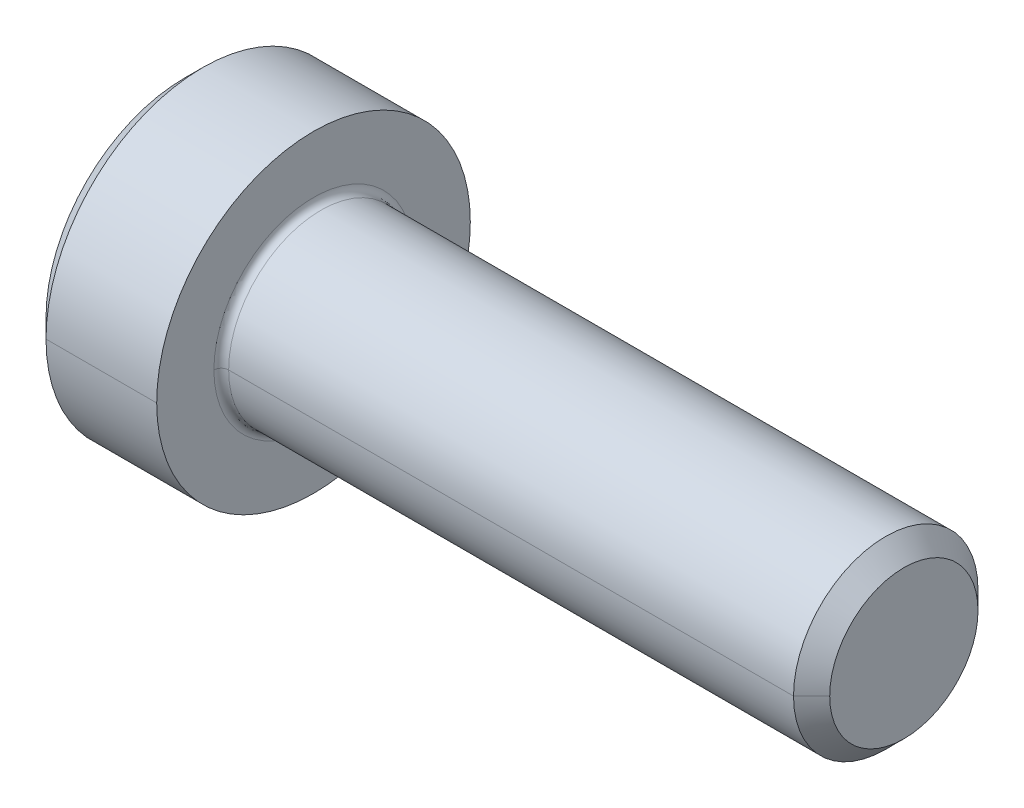
ISO-10303-21;
HEADER;
FILE_DESCRIPTION(('STEP AP214'),'2;1');
FILE_NAME('part.step','',(''),(''),'','','');
FILE_SCHEMA(('AUTOMOTIVE_DESIGN { 1 0 10303 214 1 1 1 1 }'));
ENDSEC;
DATA;
#1=APPLICATION_CONTEXT('core data for automotive mechanical design processes');
#2=APPLICATION_PROTOCOL_DEFINITION('international standard','automotive_design',2000,#1);
#3=PRODUCT_CONTEXT('',#1,'mechanical');
#4=PRODUCT('Part','Part','',(#3));
#5=PRODUCT_RELATED_PRODUCT_CATEGORY('part','',(#4));
#6=PRODUCT_DEFINITION_FORMATION('','',#4);
#7=PRODUCT_DEFINITION_CONTEXT('part definition',#1,'design');
#8=PRODUCT_DEFINITION('design','',#6,#7);
#9=PRODUCT_DEFINITION_SHAPE('','',#8);
#10=(LENGTH_UNIT() NAMED_UNIT(*) SI_UNIT(.MILLI.,.METRE.));
#11=(NAMED_UNIT(*) PLANE_ANGLE_UNIT() SI_UNIT($,.RADIAN.));
#12=(NAMED_UNIT(*) SI_UNIT($,.STERADIAN.) SOLID_ANGLE_UNIT());
#13=UNCERTAINTY_MEASURE_WITH_UNIT(LENGTH_MEASURE(1.E-05),#10,'distance_accuracy_value','');
#14=(GEOMETRIC_REPRESENTATION_CONTEXT(3) GLOBAL_UNCERTAINTY_ASSIGNED_CONTEXT((#13)) GLOBAL_UNIT_ASSIGNED_CONTEXT((#10,
#11,#12)) REPRESENTATION_CONTEXT('',''));
#15=CARTESIAN_POINT('',(0.,0.,0.));
#16=DIRECTION('',(0.,0.,1.));
#17=DIRECTION('',(1.,0.,0.));
#18=AXIS2_PLACEMENT_3D('',#15,#16,#17);
#19=CARTESIAN_POINT('',(-1.,0.,0.));
#20=DIRECTION('',(-1.,0.,0.));
#21=DIRECTION('',(0.,1.,0.));
#22=AXIS2_PLACEMENT_3D('',#19,#20,#21);
#23=CONICAL_SURFACE('',#22,2.,1.0471975512);
#24=DIRECTION('',(-0.499999999997054,0.,-0.86602540378614));
#25=VECTOR('',#24,1.);
#26=CARTESIAN_POINT('',(0.154700538370179,0.,0.));
#27=LINE('',#26,#25);
#28=CARTESIAN_POINT('',(0.15470053837925,0.,0.));
#29=VERTEX_POINT('',#28);
#30=CARTESIAN_POINT('',(-1.,0.,-2.));
#31=VERTEX_POINT('',#30);
#32=EDGE_CURVE('E11',#29,#31,#27,.T.);
#33=ORIENTED_EDGE('',*,*,#32,.T.);
#34=CARTESIAN_POINT('',(-1.,0.,0.));
#35=DIRECTION('',(1.,0.,0.));
#36=DIRECTION('',(0.,0.,-1.));
#37=AXIS2_PLACEMENT_3D('',#34,#35,#36);
#38=CIRCLE('',#37,2.);
#39=CARTESIAN_POINT('',(-1.,-1.7320508075689,-0.999999999999966));
#40=VERTEX_POINT('',#39);
#41=EDGE_CURVE('E24',#40,#31,#38,.T.);
#42=ORIENTED_EDGE('',*,*,#41,.F.);
#43=CARTESIAN_POINT('',(-1.,0.,0.));
#44=DIRECTION('',(1.,0.,0.));
#45=DIRECTION('',(0.,0.,-1.));
#46=AXIS2_PLACEMENT_3D('',#43,#44,#45);
#47=CIRCLE('',#46,2.);
#48=CARTESIAN_POINT('',(-1.,-1.7320508075689,0.999999999999966));
#49=VERTEX_POINT('',#48);
#50=EDGE_CURVE('E432',#49,#40,#47,.T.);
#51=ORIENTED_EDGE('',*,*,#50,.F.);
#52=CARTESIAN_POINT('',(-1.,0.,0.));
#53=DIRECTION('',(1.,0.,0.));
#54=DIRECTION('',(0.,0.,-1.));
#55=AXIS2_PLACEMENT_3D('',#52,#53,#54);
#56=CIRCLE('',#55,2.);
#57=CARTESIAN_POINT('',(-1.,0.,2.));
#58=VERTEX_POINT('',#57);
#59=EDGE_CURVE('E427',#58,#49,#56,.T.);
#60=ORIENTED_EDGE('',*,*,#59,.F.);
#61=DIRECTION('',(-0.499999999997054,0.,0.86602540378614));
#62=VECTOR('',#61,1.);
#63=CARTESIAN_POINT('',(0.154700538370179,0.,0.));
#64=LINE('',#63,#62);
#65=EDGE_CURVE('E422',#29,#58,#64,.T.);
#66=ORIENTED_EDGE('',*,*,#65,.F.);
#67=EDGE_LOOP('',(#33,#42,#51,#60,#66));
#68=FACE_BOUND('',#67,.T.);
#69=ADVANCED_FACE('F16',(#68),#23,.F.);
#70=CARTESIAN_POINT('',(-1.,0.,0.));
#71=DIRECTION('',(-1.,0.,0.));
#72=DIRECTION('',(0.,-1.,0.));
#73=AXIS2_PLACEMENT_3D('',#70,#71,#72);
#74=CONICAL_SURFACE('',#73,2.,1.0471975512);
#75=ORIENTED_EDGE('',*,*,#65,.T.);
#76=CARTESIAN_POINT('',(-1.,0.,0.));
#77=DIRECTION('',(1.,0.,0.));
#78=DIRECTION('',(0.,0.,-1.));
#79=AXIS2_PLACEMENT_3D('',#76,#77,#78);
#80=CIRCLE('',#79,2.);
#81=CARTESIAN_POINT('',(-1.,1.7320508075689,0.999999999999966));
#82=VERTEX_POINT('',#81);
#83=EDGE_CURVE('E417',#82,#58,#80,.T.);
#84=ORIENTED_EDGE('',*,*,#83,.F.);
#85=CARTESIAN_POINT('',(-1.,0.,0.));
#86=DIRECTION('',(1.,0.,0.));
#87=DIRECTION('',(0.,0.,-1.));
#88=AXIS2_PLACEMENT_3D('',#85,#86,#87);
#89=CIRCLE('',#88,2.);
#90=CARTESIAN_POINT('',(-1.,1.73205080756891,-0.999999999999976));
#91=VERTEX_POINT('',#90);
#92=EDGE_CURVE('E412',#91,#82,#89,.T.);
#93=ORIENTED_EDGE('',*,*,#92,.F.);
#94=CARTESIAN_POINT('',(-1.,0.,0.));
#95=DIRECTION('',(1.,0.,0.));
#96=DIRECTION('',(0.,0.,-1.));
#97=AXIS2_PLACEMENT_3D('',#94,#95,#96);
#98=CIRCLE('',#97,2.);
#99=EDGE_CURVE('E407',#31,#91,#98,.T.);
#100=ORIENTED_EDGE('',*,*,#99,.F.);
#101=ORIENTED_EDGE('',*,*,#32,.F.);
#102=EDGE_LOOP('',(#75,#84,#93,#100,#101));
#103=FACE_BOUND('',#102,.T.);
#104=ADVANCED_FACE('F465',(#103),#74,.F.);
#105=CARTESIAN_POINT('',(-1.,0.,0.));
#106=DIRECTION('',(1.,0.,0.));
#107=DIRECTION('',(0.,0.,-1.));
#108=AXIS2_PLACEMENT_3D('',#105,#106,#107);
#109=PLANE('',#108);
#110=ORIENTED_EDGE('',*,*,#99,.T.);
#111=DIRECTION('',(0.,0.499999999999983,0.866025403784448));
#112=VECTOR('',#111,1.);
#113=CARTESIAN_POINT('',(-1.,1.1547005383793,-2.));
#114=LINE('',#113,#112);
#115=CARTESIAN_POINT('',(-1.,1.1547005383793,-2.));
#116=VERTEX_POINT('',#115);
#117=EDGE_CURVE('E402',#116,#91,#114,.T.);
#118=ORIENTED_EDGE('',*,*,#117,.F.);
#119=DIRECTION('',(0.,1.,0.));
#120=VECTOR('',#119,1.);
#121=CARTESIAN_POINT('',(-1.,-1.1547005383793,-2.));
#122=LINE('',#121,#120);
#123=EDGE_CURVE('E397',#31,#116,#122,.T.);
#124=ORIENTED_EDGE('',*,*,#123,.F.);
#125=EDGE_LOOP('',(#110,#118,#124));
#126=FACE_BOUND('',#125,.T.);
#127=ADVANCED_FACE('F481',(#126),#109,.F.);
#128=CARTESIAN_POINT('',(-1.,-1.1547005383793,-2.));
#129=DIRECTION('',(0.,0.,1.));
#130=DIRECTION('',(1.,0.,0.));
#131=AXIS2_PLACEMENT_3D('',#128,#129,#130);
#132=PLANE('',#131);
#133=DIRECTION('',(0.,1.,0.));
#134=VECTOR('',#133,1.);
#135=CARTESIAN_POINT('',(-3.5,-1.1547005383793,-2.));
#136=LINE('',#135,#134);
#137=CARTESIAN_POINT('',(-3.5,-1.1547005383793,-2.));
#138=VERTEX_POINT('',#137);
#139=CARTESIAN_POINT('',(-3.5,1.1547005383793,-2.));
#140=VERTEX_POINT('',#139);
#141=EDGE_CURVE('E392',#138,#140,#136,.T.);
#142=ORIENTED_EDGE('',*,*,#141,.F.);
#143=DIRECTION('',(-1.,0.,0.));
#144=VECTOR('',#143,1.);
#145=CARTESIAN_POINT('',(-1.,-1.1547005383793,-2.));
#146=LINE('',#145,#144);
#147=CARTESIAN_POINT('',(-1.,-1.1547005383793,-2.));
#148=VERTEX_POINT('',#147);
#149=EDGE_CURVE('E387',#148,#138,#146,.T.);
#150=ORIENTED_EDGE('',*,*,#149,.F.);
#151=DIRECTION('',(0.,1.,0.));
#152=VECTOR('',#151,1.);
#153=CARTESIAN_POINT('',(-1.,-1.1547005383793,-2.));
#154=LINE('',#153,#152);
#155=EDGE_CURVE('E382',#148,#31,#154,.T.);
#156=ORIENTED_EDGE('',*,*,#155,.T.);
#157=ORIENTED_EDGE('',*,*,#123,.T.);
#158=DIRECTION('',(-1.,0.,0.));
#159=VECTOR('',#158,1.);
#160=CARTESIAN_POINT('',(-1.,1.1547005383793,-2.));
#161=LINE('',#160,#159);
#162=EDGE_CURVE('E378',#116,#140,#161,.T.);
#163=ORIENTED_EDGE('',*,*,#162,.T.);
#164=EDGE_LOOP('',(#142,#150,#156,#157,#163));
#165=FACE_BOUND('',#164,.T.);
#166=ADVANCED_FACE('F483',(#165),#132,.T.);
#167=CARTESIAN_POINT('',(-1.,1.1547005383793,-2.));
#168=DIRECTION('',(0.,-0.866025403784448,0.499999999999983));
#169=DIRECTION('',(0.,-0.499999999999983,-0.866025403784448));
#170=AXIS2_PLACEMENT_3D('',#167,#168,#169);
#171=PLANE('',#170);
#172=DIRECTION('',(0.,0.499999999999983,0.866025403784448));
#173=VECTOR('',#172,1.);
#174=CARTESIAN_POINT('',(-3.5,1.1547005383793,-2.));
#175=LINE('',#174,#173);
#176=CARTESIAN_POINT('',(-3.5,2.3094010767585,0.));
#177=VERTEX_POINT('',#176);
#178=EDGE_CURVE('E373',#140,#177,#175,.T.);
#179=ORIENTED_EDGE('',*,*,#178,.F.);
#180=ORIENTED_EDGE('',*,*,#162,.F.);
#181=ORIENTED_EDGE('',*,*,#117,.T.);
#182=DIRECTION('',(0.,0.499999999999983,0.866025403784448));
#183=VECTOR('',#182,1.);
#184=CARTESIAN_POINT('',(-1.,1.1547005383793,-2.));
#185=LINE('',#184,#183);
#186=CARTESIAN_POINT('',(-1.,2.3094010767585,0.));
#187=VERTEX_POINT('',#186);
#188=EDGE_CURVE('E369',#91,#187,#185,.T.);
#189=ORIENTED_EDGE('',*,*,#188,.T.);
#190=DIRECTION('',(-1.,0.,0.));
#191=VECTOR('',#190,1.);
#192=CARTESIAN_POINT('',(-1.,2.3094010767585,0.));
#193=LINE('',#192,#191);
#194=EDGE_CURVE('E365',#187,#177,#193,.T.);
#195=ORIENTED_EDGE('',*,*,#194,.T.);
#196=EDGE_LOOP('',(#179,#180,#181,#189,#195));
#197=FACE_BOUND('',#196,.T.);
#198=ADVANCED_FACE('F477',(#197),#171,.T.);
#199=CARTESIAN_POINT('',(-1.,2.3094010767585,0.));
#200=DIRECTION('',(0.,-0.866025403784448,-0.499999999999983));
#201=DIRECTION('',(0.,0.499999999999983,-0.866025403784448));
#202=AXIS2_PLACEMENT_3D('',#199,#200,#201);
#203=PLANE('',#202);
#204=DIRECTION('',(0.,-0.499999999999983,0.866025403784448));
#205=VECTOR('',#204,1.);
#206=CARTESIAN_POINT('',(-3.5,2.3094010767585,0.));
#207=LINE('',#206,#205);
#208=CARTESIAN_POINT('',(-3.5,1.1547005383793,2.));
#209=VERTEX_POINT('',#208);
#210=EDGE_CURVE('E360',#177,#209,#207,.T.);
#211=ORIENTED_EDGE('',*,*,#210,.F.);
#212=ORIENTED_EDGE('',*,*,#194,.F.);
#213=DIRECTION('',(0.,-0.499999999999983,0.866025403784448));
#214=VECTOR('',#213,1.);
#215=CARTESIAN_POINT('',(-1.,2.3094010767585,0.));
#216=LINE('',#215,#214);
#217=EDGE_CURVE('E355',#187,#82,#216,.T.);
#218=ORIENTED_EDGE('',*,*,#217,.T.);
#219=DIRECTION('',(0.,-0.499999999999983,0.866025403784448));
#220=VECTOR('',#219,1.);
#221=CARTESIAN_POINT('',(-1.,2.3094010767585,0.));
#222=LINE('',#221,#220);
#223=CARTESIAN_POINT('',(-1.,1.1547005383793,2.));
#224=VERTEX_POINT('',#223);
#225=EDGE_CURVE('E351',#82,#224,#222,.T.);
#226=ORIENTED_EDGE('',*,*,#225,.T.);
#227=DIRECTION('',(-1.,0.,0.));
#228=VECTOR('',#227,1.);
#229=CARTESIAN_POINT('',(-1.,1.1547005383793,2.));
#230=LINE('',#229,#228);
#231=EDGE_CURVE('E347',#224,#209,#230,.T.);
#232=ORIENTED_EDGE('',*,*,#231,.T.);
#233=EDGE_LOOP('',(#211,#212,#218,#226,#232));
#234=FACE_BOUND('',#233,.T.);
#235=ADVANCED_FACE('F470',(#234),#203,.T.);
#236=CARTESIAN_POINT('',(-1.,1.1547005383793,2.));
#237=DIRECTION('',(0.,0.,-1.));
#238=DIRECTION('',(-1.,0.,0.));
#239=AXIS2_PLACEMENT_3D('',#236,#237,#238);
#240=PLANE('',#239);
#241=DIRECTION('',(0.,-1.,0.));
#242=VECTOR('',#241,1.);
#243=CARTESIAN_POINT('',(-3.5,1.1547005383793,2.));
#244=LINE('',#243,#242);
#245=CARTESIAN_POINT('',(-3.5,-1.1547005383793,2.));
#246=VERTEX_POINT('',#245);
#247=EDGE_CURVE('E342',#209,#246,#244,.T.);
#248=ORIENTED_EDGE('',*,*,#247,.F.);
#249=ORIENTED_EDGE('',*,*,#231,.F.);
#250=DIRECTION('',(0.,-1.,0.));
#251=VECTOR('',#250,1.);
#252=CARTESIAN_POINT('',(-1.,1.1547005383793,2.));
#253=LINE('',#252,#251);
#254=EDGE_CURVE('E337',#224,#58,#253,.T.);
#255=ORIENTED_EDGE('',*,*,#254,.T.);
#256=DIRECTION('',(0.,-1.,0.));
#257=VECTOR('',#256,1.);
#258=CARTESIAN_POINT('',(-1.,1.1547005383793,2.));
#259=LINE('',#258,#257);
#260=CARTESIAN_POINT('',(-1.,-1.1547005383793,2.));
#261=VERTEX_POINT('',#260);
#262=EDGE_CURVE('E333',#58,#261,#259,.T.);
#263=ORIENTED_EDGE('',*,*,#262,.T.);
#264=DIRECTION('',(-1.,0.,0.));
#265=VECTOR('',#264,1.);
#266=CARTESIAN_POINT('',(-1.,-1.1547005383793,2.));
#267=LINE('',#266,#265);
#268=EDGE_CURVE('E329',#261,#246,#267,.T.);
#269=ORIENTED_EDGE('',*,*,#268,.T.);
#270=EDGE_LOOP('',(#248,#249,#255,#263,#269));
#271=FACE_BOUND('',#270,.T.);
#272=ADVANCED_FACE('F489',(#271),#240,.T.);
#273=CARTESIAN_POINT('',(-1.,-1.1547005383793,2.));
#274=DIRECTION('',(0.,0.866025403784448,-0.499999999999983));
#275=DIRECTION('',(0.,0.499999999999983,0.866025403784448));
#276=AXIS2_PLACEMENT_3D('',#273,#274,#275);
#277=PLANE('',#276);
#278=DIRECTION('',(0.,-0.499999999999983,-0.866025403784448));
#279=VECTOR('',#278,1.);
#280=CARTESIAN_POINT('',(-3.5,-1.1547005383793,2.));
#281=LINE('',#280,#279);
#282=CARTESIAN_POINT('',(-3.5,-2.3094010767585,0.));
#283=VERTEX_POINT('',#282);
#284=EDGE_CURVE('E324',#246,#283,#281,.T.);
#285=ORIENTED_EDGE('',*,*,#284,.F.);
#286=ORIENTED_EDGE('',*,*,#268,.F.);
#287=DIRECTION('',(0.,-0.499999999999983,-0.866025403784448));
#288=VECTOR('',#287,1.);
#289=CARTESIAN_POINT('',(-1.,-1.1547005383793,2.));
#290=LINE('',#289,#288);
#291=EDGE_CURVE('E319',#261,#49,#290,.T.);
#292=ORIENTED_EDGE('',*,*,#291,.T.);
#293=DIRECTION('',(0.,-0.499999999999983,-0.866025403784448));
#294=VECTOR('',#293,1.);
#295=CARTESIAN_POINT('',(-1.,-1.1547005383793,2.));
#296=LINE('',#295,#294);
#297=CARTESIAN_POINT('',(-1.,-2.3094010767585,0.));
#298=VERTEX_POINT('',#297);
#299=EDGE_CURVE('E315',#49,#298,#296,.T.);
#300=ORIENTED_EDGE('',*,*,#299,.T.);
#301=DIRECTION('',(-1.,0.,0.));
#302=VECTOR('',#301,1.);
#303=CARTESIAN_POINT('',(-1.,-2.3094010767585,0.));
#304=LINE('',#303,#302);
#305=EDGE_CURVE('E311',#298,#283,#304,.T.);
#306=ORIENTED_EDGE('',*,*,#305,.T.);
#307=EDGE_LOOP('',(#285,#286,#292,#300,#306));
#308=FACE_BOUND('',#307,.T.);
#309=ADVANCED_FACE('F454',(#308),#277,.T.);
#310=CARTESIAN_POINT('',(-1.,-2.3094010767585,0.));
#311=DIRECTION('',(0.,0.866025403784448,0.499999999999983));
#312=DIRECTION('',(0.,-0.499999999999983,0.866025403784448));
#313=AXIS2_PLACEMENT_3D('',#310,#311,#312);
#314=PLANE('',#313);
#315=DIRECTION('',(0.,0.499999999999983,-0.866025403784448));
#316=VECTOR('',#315,1.);
#317=CARTESIAN_POINT('',(-3.5,-2.3094010767585,0.));
#318=LINE('',#317,#316);
#319=EDGE_CURVE('E306',#283,#138,#318,.T.);
#320=ORIENTED_EDGE('',*,*,#319,.F.);
#321=ORIENTED_EDGE('',*,*,#305,.F.);
#322=DIRECTION('',(0.,0.499999999999983,-0.866025403784448));
#323=VECTOR('',#322,1.);
#324=CARTESIAN_POINT('',(-1.,-2.3094010767585,0.));
#325=LINE('',#324,#323);
#326=EDGE_CURVE('E302',#298,#40,#325,.T.);
#327=ORIENTED_EDGE('',*,*,#326,.T.);
#328=DIRECTION('',(0.,0.499999999999983,-0.866025403784448));
#329=VECTOR('',#328,1.);
#330=CARTESIAN_POINT('',(-1.,-2.3094010767585,0.));
#331=LINE('',#330,#329);
#332=EDGE_CURVE('E297',#40,#148,#331,.T.);
#333=ORIENTED_EDGE('',*,*,#332,.T.);
#334=ORIENTED_EDGE('',*,*,#149,.T.);
#335=EDGE_LOOP('',(#320,#321,#327,#333,#334));
#336=FACE_BOUND('',#335,.T.);
#337=ADVANCED_FACE('F485',(#336),#314,.T.);
#338=CARTESIAN_POINT('',(-1.,0.,0.));
#339=DIRECTION('',(1.,0.,0.));
#340=DIRECTION('',(0.,0.,-1.));
#341=AXIS2_PLACEMENT_3D('',#338,#339,#340);
#342=PLANE('',#341);
#343=ORIENTED_EDGE('',*,*,#41,.T.);
#344=ORIENTED_EDGE('',*,*,#155,.F.);
#345=ORIENTED_EDGE('',*,*,#332,.F.);
#346=EDGE_LOOP('',(#343,#344,#345));
#347=FACE_BOUND('',#346,.T.);
#348=ADVANCED_FACE('F444',(#347),#342,.F.);
#349=CARTESIAN_POINT('',(-1.,0.,0.));
#350=DIRECTION('',(1.,0.,0.));
#351=DIRECTION('',(0.,0.,-1.));
#352=AXIS2_PLACEMENT_3D('',#349,#350,#351);
#353=PLANE('',#352);
#354=ORIENTED_EDGE('',*,*,#50,.T.);
#355=ORIENTED_EDGE('',*,*,#326,.F.);
#356=ORIENTED_EDGE('',*,*,#299,.F.);
#357=EDGE_LOOP('',(#354,#355,#356));
#358=FACE_BOUND('',#357,.T.);
#359=ADVANCED_FACE('F449',(#358),#353,.F.);
#360=CARTESIAN_POINT('',(-3.5,0.,0.));
#361=DIRECTION('',(1.,0.,0.));
#362=DIRECTION('',(0.,0.,-1.));
#363=AXIS2_PLACEMENT_3D('',#360,#361,#362);
#364=PLANE('',#363);
#365=CARTESIAN_POINT('',(-3.5,0.,0.));
#366=DIRECTION('',(1.,0.,0.));
#367=DIRECTION('',(0.,0.,-1.));
#368=AXIS2_PLACEMENT_3D('',#365,#366,#367);
#369=CIRCLE('',#368,3.75);
#370=CARTESIAN_POINT('',(-3.5,0.,-3.75));
#371=VERTEX_POINT('',#370);
#372=CARTESIAN_POINT('',(-3.5,0.,3.75));
#373=VERTEX_POINT('',#372);
#374=EDGE_CURVE('E292',#371,#373,#369,.T.);
#375=ORIENTED_EDGE('',*,*,#374,.F.);
#376=CARTESIAN_POINT('',(-3.5,0.,0.));
#377=DIRECTION('',(1.,0.,0.));
#378=DIRECTION('',(0.,0.,-1.));
#379=AXIS2_PLACEMENT_3D('',#376,#377,#378);
#380=CIRCLE('',#379,3.75);
#381=EDGE_CURVE('E287',#373,#371,#380,.T.);
#382=ORIENTED_EDGE('',*,*,#381,.F.);
#383=EDGE_LOOP('',(#375,#382));
#384=FACE_BOUND('',#383,.T.);
#385=ORIENTED_EDGE('',*,*,#247,.T.);
#386=ORIENTED_EDGE('',*,*,#284,.T.);
#387=ORIENTED_EDGE('',*,*,#319,.T.);
#388=ORIENTED_EDGE('',*,*,#141,.T.);
#389=ORIENTED_EDGE('',*,*,#178,.T.);
#390=ORIENTED_EDGE('',*,*,#210,.T.);
#391=EDGE_LOOP('',(#385,#386,#387,#388,#389,#390));
#392=FACE_BOUND('',#391,.T.);
#393=ADVANCED_FACE('F487',(#384,#392),#364,.F.);
#394=CARTESIAN_POINT('',(-3.5,0.,0.));
#395=DIRECTION('',(1.,0.,0.));
#396=DIRECTION('',(0.,1.,0.));
#397=AXIS2_PLACEMENT_3D('',#394,#395,#396);
#398=CONICAL_SURFACE('',#397,3.75,0.7853981634);
#399=ORIENTED_EDGE('',*,*,#381,.T.);
#400=DIRECTION('',(0.707106781184743,0.,-0.707106781188352));
#401=VECTOR('',#400,1.);
#402=CARTESIAN_POINT('',(-3.5,0.,-3.75));
#403=LINE('',#402,#401);
#404=CARTESIAN_POINT('',(-3.,0.,-4.25));
#405=VERTEX_POINT('',#404);
#406=EDGE_CURVE('E283',#371,#405,#403,.T.);
#407=ORIENTED_EDGE('',*,*,#406,.T.);
#408=CARTESIAN_POINT('',(-3.,0.,0.));
#409=DIRECTION('',(1.,0.,0.));
#410=DIRECTION('',(0.,0.,-1.));
#411=AXIS2_PLACEMENT_3D('',#408,#409,#410);
#412=CIRCLE('',#411,4.25);
#413=CARTESIAN_POINT('',(-3.,0.,4.25));
#414=VERTEX_POINT('',#413);
#415=EDGE_CURVE('E278',#414,#405,#412,.T.);
#416=ORIENTED_EDGE('',*,*,#415,.F.);
#417=DIRECTION('',(0.707106781184743,0.,0.707106781188352));
#418=VECTOR('',#417,1.);
#419=CARTESIAN_POINT('',(-3.5,0.,3.75));
#420=LINE('',#419,#418);
#421=EDGE_CURVE('E273',#373,#414,#420,.T.);
#422=ORIENTED_EDGE('',*,*,#421,.F.);
#423=EDGE_LOOP('',(#399,#407,#416,#422));
#424=FACE_BOUND('',#423,.T.);
#425=ADVANCED_FACE('F567',(#424),#398,.T.);
#426=CARTESIAN_POINT('',(-3.5,0.,0.));
#427=DIRECTION('',(1.,0.,0.));
#428=DIRECTION('',(0.,-1.,0.));
#429=AXIS2_PLACEMENT_3D('',#426,#427,#428);
#430=CONICAL_SURFACE('',#429,3.75,0.7853981634);
#431=CARTESIAN_POINT('',(-3.,0.,0.));
#432=DIRECTION('',(1.,0.,0.));
#433=DIRECTION('',(0.,0.,-1.));
#434=AXIS2_PLACEMENT_3D('',#431,#432,#433);
#435=CIRCLE('',#434,4.25);
#436=EDGE_CURVE('E268',#405,#414,#435,.T.);
#437=ORIENTED_EDGE('',*,*,#436,.F.);
#438=ORIENTED_EDGE('',*,*,#406,.F.);
#439=ORIENTED_EDGE('',*,*,#374,.T.);
#440=ORIENTED_EDGE('',*,*,#421,.T.);
#441=EDGE_LOOP('',(#437,#438,#439,#440));
#442=FACE_BOUND('',#441,.T.);
#443=ADVANCED_FACE('F577',(#442),#430,.T.);
#444=CARTESIAN_POINT('',(16.,0.,0.));
#445=DIRECTION('',(-1.,0.,0.));
#446=DIRECTION('',(0.,-1.,0.));
#447=AXIS2_PLACEMENT_3D('',#444,#445,#446);
#448=CYLINDRICAL_SURFACE('',#447,4.25);
#449=CARTESIAN_POINT('',(0.,0.,0.));
#450=DIRECTION('',(1.,0.,0.));
#451=DIRECTION('',(0.,0.,-1.));
#452=AXIS2_PLACEMENT_3D('',#449,#450,#451);
#453=CIRCLE('',#452,4.25);
#454=CARTESIAN_POINT('',(0.,0.,-4.25));
#455=VERTEX_POINT('',#454);
#456=CARTESIAN_POINT('',(0.,0.,4.25));
#457=VERTEX_POINT('',#456);
#458=EDGE_CURVE('E263',#455,#457,#453,.T.);
#459=ORIENTED_EDGE('',*,*,#458,.F.);
#460=DIRECTION('',(-1.,0.,0.));
#461=VECTOR('',#460,1.);
#462=CARTESIAN_POINT('',(0.,0.,-4.25));
#463=LINE('',#462,#461);
#464=EDGE_CURVE('E258',#455,#405,#463,.T.);
#465=ORIENTED_EDGE('',*,*,#464,.T.);
#466=ORIENTED_EDGE('',*,*,#436,.T.);
#467=DIRECTION('',(-1.,0.,0.));
#468=VECTOR('',#467,1.);
#469=CARTESIAN_POINT('',(0.,0.,4.25));
#470=LINE('',#469,#468);
#471=EDGE_CURVE('E253',#457,#414,#470,.T.);
#472=ORIENTED_EDGE('',*,*,#471,.F.);
#473=EDGE_LOOP('',(#459,#465,#466,#472));
#474=FACE_BOUND('',#473,.T.);
#475=ADVANCED_FACE('F587',(#474),#448,.T.);
#476=CARTESIAN_POINT('',(16.,0.,0.));
#477=DIRECTION('',(-1.,0.,0.));
#478=DIRECTION('',(0.,1.,0.));
#479=AXIS2_PLACEMENT_3D('',#476,#477,#478);
#480=CYLINDRICAL_SURFACE('',#479,4.25);
#481=ORIENTED_EDGE('',*,*,#415,.T.);
#482=ORIENTED_EDGE('',*,*,#464,.F.);
#483=CARTESIAN_POINT('',(0.,0.,0.));
#484=DIRECTION('',(1.,0.,0.));
#485=DIRECTION('',(0.,0.,-1.));
#486=AXIS2_PLACEMENT_3D('',#483,#484,#485);
#487=CIRCLE('',#486,4.25);
#488=EDGE_CURVE('E248',#457,#455,#487,.T.);
#489=ORIENTED_EDGE('',*,*,#488,.F.);
#490=ORIENTED_EDGE('',*,*,#471,.T.);
#491=EDGE_LOOP('',(#481,#482,#489,#490));
#492=FACE_BOUND('',#491,.T.);
#493=ADVANCED_FACE('F597',(#492),#480,.T.);
#494=CARTESIAN_POINT('',(0.,4.25,0.));
#495=DIRECTION('',(-1.,0.,0.));
#496=DIRECTION('',(0.,0.,1.));
#497=AXIS2_PLACEMENT_3D('',#494,#495,#496);
#498=PLANE('',#497);
#499=CARTESIAN_POINT('',(0.,0.,0.));
#500=DIRECTION('',(1.,0.,0.));
#501=DIRECTION('',(0.,0.,-1.));
#502=AXIS2_PLACEMENT_3D('',#499,#500,#501);
#503=CIRCLE('',#502,2.7);
#504=CARTESIAN_POINT('',(0.,0.,-2.7));
#505=VERTEX_POINT('',#504);
#506=CARTESIAN_POINT('',(0.,0.,2.7));
#507=VERTEX_POINT('',#506);
#508=EDGE_CURVE('E244',#505,#507,#503,.T.);
#509=ORIENTED_EDGE('',*,*,#508,.F.);
#510=CARTESIAN_POINT('',(0.,0.,0.));
#511=DIRECTION('',(1.,0.,0.));
#512=DIRECTION('',(0.,0.,-1.));
#513=AXIS2_PLACEMENT_3D('',#510,#511,#512);
#514=CIRCLE('',#513,2.7);
#515=EDGE_CURVE('E240',#507,#505,#514,.T.);
#516=ORIENTED_EDGE('',*,*,#515,.F.);
#517=EDGE_LOOP('',(#509,#516));
#518=FACE_BOUND('',#517,.T.);
#519=ORIENTED_EDGE('',*,*,#458,.T.);
#520=ORIENTED_EDGE('',*,*,#488,.T.);
#521=EDGE_LOOP('',(#519,#520));
#522=FACE_BOUND('',#521,.T.);
#523=ADVANCED_FACE('F607',(#518,#522),#498,.F.);
#524=CARTESIAN_POINT('',(0.200000000000017,0.,0.));
#525=DIRECTION('',(1.,0.,0.));
#526=DIRECTION('',(0.,1.,0.));
#527=AXIS2_PLACEMENT_3D('',#524,#525,#526);
#528=TOROIDAL_SURFACE('',#527,2.7,0.2);
#529=CARTESIAN_POINT('',(0.199999999999999,0.,0.));
#530=DIRECTION('',(1.,0.,0.));
#531=DIRECTION('',(0.,0.,-1.));
#532=AXIS2_PLACEMENT_3D('',#529,#530,#531);
#533=CIRCLE('',#532,2.5);
#534=CARTESIAN_POINT('',(0.199999999999999,0.,2.5));
#535=VERTEX_POINT('',#534);
#536=CARTESIAN_POINT('',(0.199999999999999,0.,-2.5));
#537=VERTEX_POINT('',#536);
#538=EDGE_CURVE('E237',#535,#537,#533,.T.);
#539=ORIENTED_EDGE('',*,*,#538,.F.);
#540=CARTESIAN_POINT('',(0.199999999999999,0.,2.5));
#541=CARTESIAN_POINT('',(0.196727504347822,0.,2.49999993058225));
#542=CARTESIAN_POINT('',(0.193455014602414,0.,2.50008031657497));
#543=CARTESIAN_POINT('',(0.186917915666618,0.,2.50040150094296));
#544=CARTESIAN_POINT('',(0.18365330647623,0.,2.50064229931823));
#545=CARTESIAN_POINT('',(0.177139837391947,0.,2.50128381001289));
#546=CARTESIAN_POINT('',(0.173890977498054,0.,2.50168452233229));
#547=CARTESIAN_POINT('',(0.167416832719804,0.,2.5026448736818));
#548=CARTESIAN_POINT('',(0.164191547835447,0.,2.50320451271192));
#549=CARTESIAN_POINT('',(0.157772323358106,0.,2.50448137512679));
#550=CARTESIAN_POINT('',(0.154578383765121,0.,2.50519859851154));
#551=CARTESIAN_POINT('',(0.148229544273579,0.,2.50678890021065));
#552=CARTESIAN_POINT('',(0.14507464437502,0.,2.507661978525));
#553=CARTESIAN_POINT('',(0.138811484723202,0.,2.50956188718213));
#554=CARTESIAN_POINT('',(0.135703224969942,0.,2.51058871752491));
#555=CARTESIAN_POINT('',(0.129540833673178,0.,2.51279365640189));
#556=CARTESIAN_POINT('',(0.126486702129673,0.,2.51397176493607));
#557=CARTESIAN_POINT('',(0.120439924924301,0.,2.51647642205942));
#558=CARTESIAN_POINT('',(0.117447279262434,0.,2.51780297064859));
#559=CARTESIAN_POINT('',(0.111530683365465,0.,2.52060131210205));
#560=CARTESIAN_POINT('',(0.108606733130362,0.,2.52207310496635));
#561=CARTESIAN_POINT('',(0.102834572139252,0.,2.52515838929432));
#562=CARTESIAN_POINT('',(0.0999863613832445,0.,2.526771880758));
#563=CARTESIAN_POINT('',(0.0943725409394812,0.,2.5301366752419));
#564=CARTESIAN_POINT('',(0.0916069312517255,0.,2.53188797826212));
#565=CARTESIAN_POINT('',(0.0861649755404497,0.,2.53552417681688));
#566=CARTESIAN_POINT('',(0.0834886295169298,0.,2.53740907235142));
#567=CARTESIAN_POINT('',(0.0782316486861145,0.,2.54130791505634));
#568=CARTESIAN_POINT('',(0.0756510138788192,0.,2.54332186222672));
#569=CARTESIAN_POINT('',(0.0705916724557416,0.,2.5474739564282));
#570=CARTESIAN_POINT('',(0.0681129658399593,0.,2.5496121034593));
#571=CARTESIAN_POINT('',(0.0632634522212539,0.,2.55400744639873));
#572=CARTESIAN_POINT('',(0.0608926452183307,0.,2.55626464230707));
#573=CARTESIAN_POINT('',(0.0562646423070721,0.,2.56089264521833));
#574=CARTESIAN_POINT('',(0.0540074463987367,0.,2.56326345222125));
#575=CARTESIAN_POINT('',(0.0496121034593029,0.,2.56811296583996));
#576=CARTESIAN_POINT('',(0.0474739564282046,0.,2.57059167245574));
#577=CARTESIAN_POINT('',(0.0433218622267253,0.,2.57565101387882));
#578=CARTESIAN_POINT('',(0.0413079150563444,0.,2.57823164868611));
#579=CARTESIAN_POINT('',(0.0374090723514234,0.,2.58348862951693));
#580=CARTESIAN_POINT('',(0.0355241768168834,0.,2.58616497554045));
#581=CARTESIAN_POINT('',(0.0318879782621257,0.,2.59160693125172));
#582=CARTESIAN_POINT('',(0.030136675241908,0.,2.59437254093948));
#583=CARTESIAN_POINT('',(0.0267718807580112,0.,2.59998636138324));
#584=CARTESIAN_POINT('',(0.0251583892943322,0.,2.60283457213925));
#585=CARTESIAN_POINT('',(0.022073104966355,0.,2.60860673313036));
#586=CARTESIAN_POINT('',(0.0206013121020569,0.,2.61153068336546));
#587=CARTESIAN_POINT('',(0.0178029706485958,0.,2.61744727926243));
#588=CARTESIAN_POINT('',(0.0164764220594328,0.,2.6204399249243));
#589=CARTESIAN_POINT('',(0.0139717649360835,0.,2.62648670212967));
#590=CARTESIAN_POINT('',(0.0127936564018972,0.,2.62954083367318));
#591=CARTESIAN_POINT('',(0.0105887175249261,0.,2.63570322496994));
#592=CARTESIAN_POINT('',(0.00956188718214137,0.,2.6388114847232));
#593=CARTESIAN_POINT('',(0.00766197852500734,0.,2.64507464437502));
#594=CARTESIAN_POINT('',(0.00678890021065807,0.,2.64822954427358));
#595=CARTESIAN_POINT('',(0.00519859851155718,0.,2.65457838376512));
#596=CARTESIAN_POINT('',(0.00448137512680554,0.,2.65777232335811));
#597=CARTESIAN_POINT('',(0.0032045127119356,0.,2.66419154783545));
#598=CARTESIAN_POINT('',(0.0026448736818173,0.,2.6674168327198));
#599=CARTESIAN_POINT('',(0.00168452233230394,0.,2.67389097749805));
#600=CARTESIAN_POINT('',(0.0012838100129089,0.,2.67713983739195));
#601=CARTESIAN_POINT('',(0.000642299318246216,0.,2.68365330647623));
#602=CARTESIAN_POINT('',(0.000401500942978575,0.,2.68691791566662));
#603=CARTESIAN_POINT('',(8.03165749864584E-05,0.,2.69345501460241));
#604=CARTESIAN_POINT('',(-6.94177380133012E-08,0.,2.69672750434782));
#605=CARTESIAN_POINT('',(0.,0.,2.7));
#606=B_SPLINE_CURVE_WITH_KNOTS('',3,(#540,#541,#542,#543,#544,#545,#546,#547,#548,#549,#550,
#551,#552,#553,#554,#555,#556,#557,#558,#559,#560,#561,#562,#563,#564,#565,#566,#567,#568,#569,
#570,#571,#572,#573,#574,#575,#576,#577,#578,#579,#580,#581,#582,#583,#584,#585,#586,#587,#588,
#589,#590,#591,#592,#593,#594,#595,#596,#597,#598,#599,#600,#601,#602,#603,#604,#605),
.UNSPECIFIED.,.F.,.F.,(4,2,2,2,2,2,2,2,2,2,2,2,2,2,2,2,2,2,2,2,2,2,2,2,2,2,2,2,2,2,2,2,4),(0.,
0.00981649140916436,0.0196329828183287,0.029449474227493,0.0392659656366575,0.0490824570458218,
0.0588989484549862,0.0687154398641504,0.0785319312733149,0.0883484226824792,0.0981649140916437,
0.107981405500808,0.117797896909972,0.127614388319136,0.137430879728301,0.147247371137465,
0.15706386254663,0.166880353955794,0.176696845364959,0.186513336774123,0.196329828183287,
0.206146319592451,0.215962811001616,0.22577930241078,0.235595793819945,0.245412285229109,
0.255228776638273,0.265045268047438,0.274861759456602,0.284678250865766,0.294494742274931,
0.304311233684095,0.314127725093259),.UNSPECIFIED.);
#607=EDGE_CURVE('E214',#535,#507,#606,.T.);
#608=ORIENTED_EDGE('',*,*,#607,.T.);
#609=ORIENTED_EDGE('',*,*,#515,.T.);
#610=CARTESIAN_POINT('',(0.199999999999999,0.,-2.5));
#611=CARTESIAN_POINT('',(0.196727504347821,0.,-2.49999993058224));
#612=CARTESIAN_POINT('',(0.193455014602414,0.,-2.50008031657497));
#613=CARTESIAN_POINT('',(0.186917915666618,0.,-2.50040150094296));
#614=CARTESIAN_POINT('',(0.183653306476229,0.,-2.50064229931823));
#615=CARTESIAN_POINT('',(0.177139837391947,0.,-2.50128381001289));
#616=CARTESIAN_POINT('',(0.173890977498054,0.,-2.50168452233229));
#617=CARTESIAN_POINT('',(0.167416832719804,0.,-2.5026448736818));
#618=CARTESIAN_POINT('',(0.164191547835447,0.,-2.50320451271192));
#619=CARTESIAN_POINT('',(0.157772323358105,0.,-2.50448137512679));
#620=CARTESIAN_POINT('',(0.154578383765121,0.,-2.50519859851154));
#621=CARTESIAN_POINT('',(0.148229544273578,0.,-2.50678890021065));
#622=CARTESIAN_POINT('',(0.14507464437502,0.,-2.507661978525));
#623=CARTESIAN_POINT('',(0.138811484723202,0.,-2.50956188718213));
#624=CARTESIAN_POINT('',(0.135703224969942,0.,-2.51058871752492));
#625=CARTESIAN_POINT('',(0.129540833673178,0.,-2.51279365640189));
#626=CARTESIAN_POINT('',(0.126486702129673,0.,-2.51397176493607));
#627=CARTESIAN_POINT('',(0.120439924924301,0.,-2.51647642205942));
#628=CARTESIAN_POINT('',(0.117447279262434,0.,-2.51780297064859));
#629=CARTESIAN_POINT('',(0.111530683365464,0.,-2.52060131210205));
#630=CARTESIAN_POINT('',(0.108606733130362,0.,-2.52207310496635));
#631=CARTESIAN_POINT('',(0.102834572139252,0.,-2.52515838929432));
#632=CARTESIAN_POINT('',(0.0999863613832443,0.,-2.526771880758));
#633=CARTESIAN_POINT('',(0.0943725409394811,0.,-2.5301366752419));
#634=CARTESIAN_POINT('',(0.0916069312517252,0.,-2.53188797826212));
#635=CARTESIAN_POINT('',(0.0861649755404494,0.,-2.53552417681688));
#636=CARTESIAN_POINT('',(0.0834886295169295,0.,-2.53740907235142));
#637=CARTESIAN_POINT('',(0.0782316486861143,0.,-2.54130791505634));
#638=CARTESIAN_POINT('',(0.075651013878819,0.,-2.54332186222672));
#639=CARTESIAN_POINT('',(0.0705916724557414,0.,-2.5474739564282));
#640=CARTESIAN_POINT('',(0.0681129658399591,0.,-2.5496121034593));
#641=CARTESIAN_POINT('',(0.0632634522212536,0.,-2.55400744639873));
#642=CARTESIAN_POINT('',(0.0608926452183305,0.,-2.55626464230707));
#643=CARTESIAN_POINT('',(0.056264642307072,0.,-2.56089264521833));
#644=CARTESIAN_POINT('',(0.0540074463987366,0.,-2.56326345222125));
#645=CARTESIAN_POINT('',(0.0496121034593027,0.,-2.56811296583996));
#646=CARTESIAN_POINT('',(0.0474739564282043,0.,-2.57059167245574));
#647=CARTESIAN_POINT('',(0.0433218622267251,0.,-2.57565101387882));
#648=CARTESIAN_POINT('',(0.0413079150563442,0.,-2.57823164868611));
#649=CARTESIAN_POINT('',(0.0374090723514233,0.,-2.58348862951693));
#650=CARTESIAN_POINT('',(0.0355241768168831,0.,-2.58616497554045));
#651=CARTESIAN_POINT('',(0.0318879782621254,0.,-2.59160693125172));
#652=CARTESIAN_POINT('',(0.0301366752419079,0.,-2.59437254093948));
#653=CARTESIAN_POINT('',(0.0267718807580112,0.,-2.59998636138324));
#654=CARTESIAN_POINT('',(0.025158389294332,0.,-2.60283457213925));
#655=CARTESIAN_POINT('',(0.0220731049663548,0.,-2.60860673313036));
#656=CARTESIAN_POINT('',(0.0206013121020568,0.,-2.61153068336546));
#657=CARTESIAN_POINT('',(0.0178029706485957,0.,-2.61744727926243));
#658=CARTESIAN_POINT('',(0.0164764220594326,0.,-2.6204399249243));
#659=CARTESIAN_POINT('',(0.0139717649360833,0.,-2.62648670212967));
#660=CARTESIAN_POINT('',(0.0127936564018971,0.,-2.62954083367318));
#661=CARTESIAN_POINT('',(0.0105887175249261,0.,-2.63570322496994));
#662=CARTESIAN_POINT('',(0.00956188718214132,0.,-2.6388114847232));
#663=CARTESIAN_POINT('',(0.00766197852500728,0.,-2.64507464437502));
#664=CARTESIAN_POINT('',(0.00678890021065802,0.,-2.64822954427358));
#665=CARTESIAN_POINT('',(0.00519859851155711,0.,-2.65457838376512));
#666=CARTESIAN_POINT('',(0.00448137512680545,0.,-2.65777232335811));
#667=CARTESIAN_POINT('',(0.00320451271193553,0.,-2.66419154783545));
#668=CARTESIAN_POINT('',(0.00264487368181727,0.,-2.6674168327198));
#669=CARTESIAN_POINT('',(0.00168452233230395,0.,-2.67389097749805));
#670=CARTESIAN_POINT('',(0.00128381001290887,0.,-2.67713983739195));
#671=CARTESIAN_POINT('',(0.000642299318246158,0.,-2.68365330647623));
#672=CARTESIAN_POINT('',(0.00040150094297853,0.,-2.68691791566662));
#673=CARTESIAN_POINT('',(8.03165749864561E-05,0.,-2.69345501460241));
#674=CARTESIAN_POINT('',(-6.94177379933738E-08,0.,-2.69672750434782));
#675=CARTESIAN_POINT('',(0.,0.,-2.7));
#676=B_SPLINE_CURVE_WITH_KNOTS('',3,(#610,#611,#612,#613,#614,#615,#616,#617,#618,#619,#620,
#621,#622,#623,#624,#625,#626,#627,#628,#629,#630,#631,#632,#633,#634,#635,#636,#637,#638,#639,
#640,#641,#642,#643,#644,#645,#646,#647,#648,#649,#650,#651,#652,#653,#654,#655,#656,#657,#658,
#659,#660,#661,#662,#663,#664,#665,#666,#667,#668,#669,#670,#671,#672,#673,#674,#675),
.UNSPECIFIED.,.F.,.F.,(4,2,2,2,2,2,2,2,2,2,2,2,2,2,2,2,2,2,2,2,2,2,2,2,2,2,2,2,2,2,2,2,4),(0.,
0.00981649140916433,0.0196329828183287,0.029449474227493,0.0392659656366574,0.0490824570458218,
0.0588989484549861,0.0687154398641505,0.0785319312733147,0.0883484226824791,0.0981649140916436,
0.107981405500808,0.117797896909972,0.127614388319137,0.137430879728301,0.147247371137465,
0.15706386254663,0.166880353955794,0.176696845364958,0.186513336774123,0.196329828183287,
0.206146319592451,0.215962811001616,0.22577930241078,0.235595793819944,0.245412285229109,
0.255228776638273,0.265045268047438,0.274861759456602,0.284678250865766,0.29449474227493,
0.304311233684095,0.314127725093259),.UNSPECIFIED.);
#677=EDGE_CURVE('E227',#537,#505,#676,.T.);
#678=ORIENTED_EDGE('',*,*,#677,.F.);
#679=EDGE_LOOP('',(#539,#608,#609,#678));
#680=FACE_BOUND('',#679,.T.);
#681=ADVANCED_FACE('F192',(#680),#528,.F.);
#682=CARTESIAN_POINT('',(0.200000000000017,0.,0.));
#683=DIRECTION('',(1.,0.,0.));
#684=DIRECTION('',(0.,-1.,0.));
#685=AXIS2_PLACEMENT_3D('',#682,#683,#684);
#686=TOROIDAL_SURFACE('',#685,2.7,0.2);
#687=ORIENTED_EDGE('',*,*,#508,.T.);
#688=ORIENTED_EDGE('',*,*,#607,.F.);
#689=CARTESIAN_POINT('',(0.199999999999999,0.,0.));
#690=DIRECTION('',(1.,0.,0.));
#691=DIRECTION('',(0.,0.,-1.));
#692=AXIS2_PLACEMENT_3D('',#689,#690,#691);
#693=CIRCLE('',#692,2.5);
#694=EDGE_CURVE('E172',#537,#535,#693,.T.);
#695=ORIENTED_EDGE('',*,*,#694,.F.);
#696=ORIENTED_EDGE('',*,*,#677,.T.);
#697=EDGE_LOOP('',(#687,#688,#695,#696));
#698=FACE_BOUND('',#697,.T.);
#699=ADVANCED_FACE('F181',(#698),#686,.F.);
#700=CARTESIAN_POINT('',(16.,0.,0.));
#701=DIRECTION('',(-1.,0.,0.));
#702=DIRECTION('',(0.,-1.,0.));
#703=AXIS2_PLACEMENT_3D('',#700,#701,#702);
#704=CYLINDRICAL_SURFACE('',#703,2.5);
#705=CARTESIAN_POINT('',(15.5095,0.,0.));
#706=DIRECTION('',(1.,0.,0.));
#707=DIRECTION('',(0.,0.,-1.));
#708=AXIS2_PLACEMENT_3D('',#705,#706,#707);
#709=CIRCLE('',#708,2.5);
#710=CARTESIAN_POINT('',(15.5095,0.,-2.5));
#711=VERTEX_POINT('',#710);
#712=CARTESIAN_POINT('',(15.5095,0.,2.5));
#713=VERTEX_POINT('',#712);
#714=EDGE_CURVE('E143',#711,#713,#709,.T.);
#715=ORIENTED_EDGE('',*,*,#714,.F.);
#716=DIRECTION('',(-1.,0.,0.));
#717=VECTOR('',#716,1.);
#718=CARTESIAN_POINT('',(15.5095,0.,-2.5));
#719=LINE('',#718,#717);
#720=EDGE_CURVE('E164',#711,#537,#719,.T.);
#721=ORIENTED_EDGE('',*,*,#720,.T.);
#722=ORIENTED_EDGE('',*,*,#694,.T.);
#723=DIRECTION('',(-1.,0.,0.));
#724=VECTOR('',#723,1.);
#725=CARTESIAN_POINT('',(15.5095,0.,2.5));
#726=LINE('',#725,#724);
#727=EDGE_CURVE('E159',#713,#535,#726,.T.);
#728=ORIENTED_EDGE('',*,*,#727,.F.);
#729=EDGE_LOOP('',(#715,#721,#722,#728));
#730=FACE_BOUND('',#729,.T.);
#731=ADVANCED_FACE('F191',(#730),#704,.T.);
#732=CARTESIAN_POINT('',(16.,0.,0.));
#733=DIRECTION('',(-1.,0.,0.));
#734=DIRECTION('',(0.,1.,0.));
#735=AXIS2_PLACEMENT_3D('',#732,#733,#734);
#736=CYLINDRICAL_SURFACE('',#735,2.5);
#737=ORIENTED_EDGE('',*,*,#538,.T.);
#738=ORIENTED_EDGE('',*,*,#720,.F.);
#739=CARTESIAN_POINT('',(15.5095,0.,0.));
#740=DIRECTION('',(1.,0.,0.));
#741=DIRECTION('',(0.,0.,-1.));
#742=AXIS2_PLACEMENT_3D('',#739,#740,#741);
#743=CIRCLE('',#742,2.5);
#744=EDGE_CURVE('E155',#713,#711,#743,.T.);
#745=ORIENTED_EDGE('',*,*,#744,.F.);
#746=ORIENTED_EDGE('',*,*,#727,.T.);
#747=EDGE_LOOP('',(#737,#738,#745,#746));
#748=FACE_BOUND('',#747,.T.);
#749=ADVANCED_FACE('F638',(#748),#736,.T.);
#750=CARTESIAN_POINT('',(15.5095,0.,0.));
#751=DIRECTION('',(-1.,0.,0.));
#752=DIRECTION('',(0.,1.,0.));
#753=AXIS2_PLACEMENT_3D('',#750,#751,#752);
#754=CONICAL_SURFACE('',#753,2.5,0.7853981634);
#755=ORIENTED_EDGE('',*,*,#744,.T.);
#756=DIRECTION('',(-0.707106781184742,0.,-0.707106781188354));
#757=VECTOR('',#756,1.);
#758=CARTESIAN_POINT('',(15.9999999999987,0.,-2.00949999999875));
#759=LINE('',#758,#757);
#760=CARTESIAN_POINT('',(16.,0.,-2.0095));
#761=VERTEX_POINT('',#760);
#762=EDGE_CURVE('E135',#761,#711,#759,.T.);
#763=ORIENTED_EDGE('',*,*,#762,.F.);
#764=CARTESIAN_POINT('',(16.,0.,0.));
#765=DIRECTION('',(1.,0.,0.));
#766=DIRECTION('',(0.,0.,-1.));
#767=AXIS2_PLACEMENT_3D('',#764,#765,#766);
#768=CIRCLE('',#767,2.0095);
#769=CARTESIAN_POINT('',(15.9999999999987,0.,2.00949999999875));
#770=VERTEX_POINT('',#769);
#771=EDGE_CURVE('E128',#770,#761,#768,.T.);
#772=ORIENTED_EDGE('',*,*,#771,.F.);
#773=DIRECTION('',(-0.707106781184742,0.,0.707106781188354));
#774=VECTOR('',#773,1.);
#775=CARTESIAN_POINT('',(15.9999999999987,0.,2.00949999999875));
#776=LINE('',#775,#774);
#777=EDGE_CURVE('E132',#770,#713,#776,.T.);
#778=ORIENTED_EDGE('',*,*,#777,.T.);
#779=EDGE_LOOP('',(#755,#763,#772,#778));
#780=FACE_BOUND('',#779,.T.);
#781=ADVANCED_FACE('F131',(#780),#754,.T.);
#782=CARTESIAN_POINT('',(15.5095,0.,0.));
#783=DIRECTION('',(-1.,0.,0.));
#784=DIRECTION('',(0.,-1.,0.));
#785=AXIS2_PLACEMENT_3D('',#782,#783,#784);
#786=CONICAL_SURFACE('',#785,2.5,0.7853981634);
#787=CARTESIAN_POINT('',(16.,0.,0.));
#788=DIRECTION('',(1.,0.,0.));
#789=DIRECTION('',(0.,0.,-1.));
#790=AXIS2_PLACEMENT_3D('',#787,#788,#789);
#791=CIRCLE('',#790,2.0095);
#792=EDGE_CURVE('E142',#761,#770,#791,.T.);
#793=ORIENTED_EDGE('',*,*,#792,.F.);
#794=ORIENTED_EDGE('',*,*,#762,.T.);
#795=ORIENTED_EDGE('',*,*,#714,.T.);
#796=ORIENTED_EDGE('',*,*,#777,.F.);
#797=EDGE_LOOP('',(#793,#794,#795,#796));
#798=FACE_BOUND('',#797,.T.);
#799=ADVANCED_FACE('F141',(#798),#786,.T.);
#800=CARTESIAN_POINT('',(16.,2.0095,0.));
#801=DIRECTION('',(-1.,0.,0.));
#802=DIRECTION('',(0.,0.,1.));
#803=AXIS2_PLACEMENT_3D('',#800,#801,#802);
#804=PLANE('',#803);
#805=ORIENTED_EDGE('',*,*,#792,.T.);
#806=ORIENTED_EDGE('',*,*,#771,.T.);
#807=EDGE_LOOP('',(#805,#806));
#808=FACE_BOUND('',#807,.T.);
#809=ADVANCED_FACE('F145',(#808),#804,.F.);
#810=CARTESIAN_POINT('',(-1.,0.,0.));
#811=DIRECTION('',(1.,0.,0.));
#812=DIRECTION('',(0.,0.,-1.));
#813=AXIS2_PLACEMENT_3D('',#810,#811,#812);
#814=PLANE('',#813);
#815=ORIENTED_EDGE('',*,*,#59,.T.);
#816=ORIENTED_EDGE('',*,*,#291,.F.);
#817=ORIENTED_EDGE('',*,*,#262,.F.);
#818=EDGE_LOOP('',(#815,#816,#817));
#819=FACE_BOUND('',#818,.T.);
#820=ADVANCED_FACE('F458',(#819),#814,.F.);
#821=CARTESIAN_POINT('',(-1.,0.,0.));
#822=DIRECTION('',(1.,0.,0.));
#823=DIRECTION('',(0.,0.,-1.));
#824=AXIS2_PLACEMENT_3D('',#821,#822,#823);
#825=PLANE('',#824);
#826=ORIENTED_EDGE('',*,*,#83,.T.);
#827=ORIENTED_EDGE('',*,*,#254,.F.);
#828=ORIENTED_EDGE('',*,*,#225,.F.);
#829=EDGE_LOOP('',(#826,#827,#828));
#830=FACE_BOUND('',#829,.T.);
#831=ADVANCED_FACE('F463',(#830),#825,.F.);
#832=CARTESIAN_POINT('',(-1.,0.,0.));
#833=DIRECTION('',(1.,0.,0.));
#834=DIRECTION('',(0.,0.,-1.));
#835=AXIS2_PLACEMENT_3D('',#832,#833,#834);
#836=PLANE('',#835);
#837=ORIENTED_EDGE('',*,*,#92,.T.);
#838=ORIENTED_EDGE('',*,*,#217,.F.);
#839=ORIENTED_EDGE('',*,*,#188,.F.);
#840=EDGE_LOOP('',(#837,#838,#839));
#841=FACE_BOUND('',#840,.T.);
#842=ADVANCED_FACE('F474',(#841),#836,.F.);
#843=CLOSED_SHELL('',(#69,#104,#127,#166,#198,#235,#272,#309,#337,#348,#359,#393,#425,#443,#475,
#493,#523,#681,#699,#731,#749,#781,#799,#809,#820,#831,#842));
#844=MANIFOLD_SOLID_BREP('B1',#843);
#845=ADVANCED_BREP_SHAPE_REPRESENTATION('',(#18,#844),#14);
#846=SHAPE_DEFINITION_REPRESENTATION(#9,#845);
ENDSEC;
END-ISO-10303-21;
